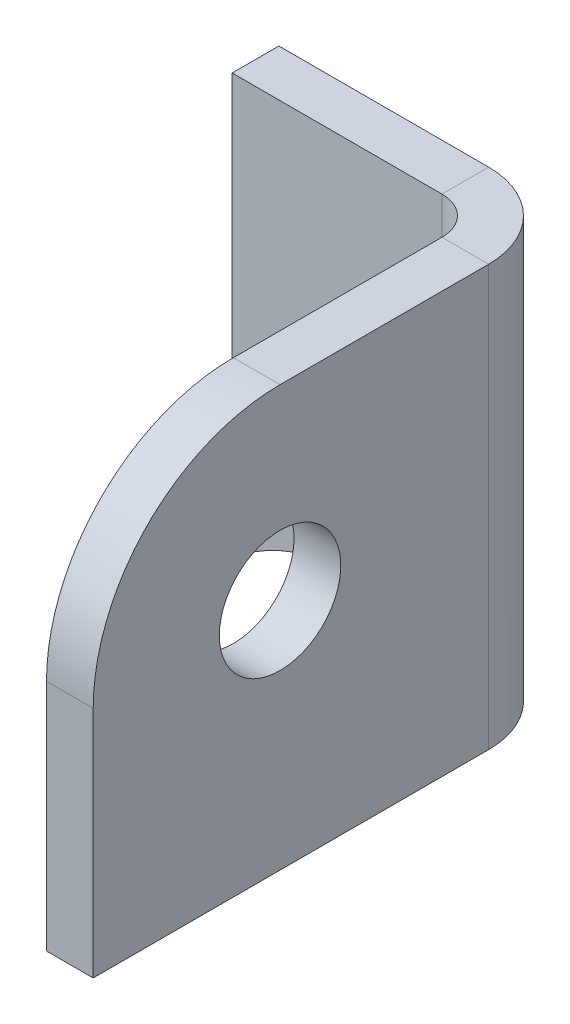
ISO-10303-21;
HEADER;
FILE_DESCRIPTION(('STEP AP214'),'2;1');
FILE_NAME('part.step','',(''),(''),'','','');
FILE_SCHEMA(('AUTOMOTIVE_DESIGN { 1 0 10303 214 1 1 1 1 }'));
ENDSEC;
DATA;
#1=APPLICATION_CONTEXT('core data for automotive mechanical design processes');
#2=APPLICATION_PROTOCOL_DEFINITION('international standard','automotive_design',2000,#1);
#3=PRODUCT_CONTEXT('',#1,'mechanical');
#4=PRODUCT('Part','Part','',(#3));
#5=PRODUCT_RELATED_PRODUCT_CATEGORY('part','',(#4));
#6=PRODUCT_DEFINITION_FORMATION('','',#4);
#7=PRODUCT_DEFINITION_CONTEXT('part definition',#1,'design');
#8=PRODUCT_DEFINITION('design','',#6,#7);
#9=PRODUCT_DEFINITION_SHAPE('','',#8);
#10=(LENGTH_UNIT() NAMED_UNIT(*) SI_UNIT(.MILLI.,.METRE.));
#11=(NAMED_UNIT(*) PLANE_ANGLE_UNIT() SI_UNIT($,.RADIAN.));
#12=(NAMED_UNIT(*) SI_UNIT($,.STERADIAN.) SOLID_ANGLE_UNIT());
#13=UNCERTAINTY_MEASURE_WITH_UNIT(LENGTH_MEASURE(1.E-05),#10,'distance_accuracy_value','');
#14=(GEOMETRIC_REPRESENTATION_CONTEXT(3) GLOBAL_UNCERTAINTY_ASSIGNED_CONTEXT((#13)) GLOBAL_UNIT_ASSIGNED_CONTEXT((#10,
#11,#12)) REPRESENTATION_CONTEXT('',''));
#15=CARTESIAN_POINT('',(0.,0.,0.));
#16=DIRECTION('',(0.,0.,1.));
#17=DIRECTION('',(1.,0.,0.));
#18=AXIS2_PLACEMENT_3D('',#15,#16,#17);
#19=CARTESIAN_POINT('',(16.80052301263,1.08510692792274E-06,1.77153816115405));
#20=DIRECTION('',(0.,-1.,0.));
#21=DIRECTION('',(0.,0.,1.));
#22=AXIS2_PLACEMENT_3D('',#19,#20,#21);
#23=PLANE('',#22);
#24=DIRECTION('',(0.,0.,1.));
#25=VECTOR('',#24,1.);
#26=CARTESIAN_POINT('',(16.80052301263,1.08510692792274E-06,1.77153816115405));
#27=LINE('',#26,#25);
#28=CARTESIAN_POINT('',(16.80052301263,1.08510692792274E-06,5.71500000000001));
#29=VERTEX_POINT('',#28);
#30=CARTESIAN_POINT('',(16.8005230126299,1.08510692792274E-06,32.596015148524));
#31=VERTEX_POINT('',#30);
#32=EDGE_CURVE('E146',#29,#31,#27,.T.);
#33=ORIENTED_EDGE('',*,*,#32,.F.);
#34=DIRECTION('',(1.,0.,0.));
#35=VECTOR('',#34,1.);
#36=CARTESIAN_POINT('',(16.80052301263,1.08510692792274E-06,5.71500000000001));
#37=LINE('',#36,#35);
#38=CARTESIAN_POINT('',(19.97552301263,1.08510691404495E-06,5.71500000000002));
#39=VERTEX_POINT('',#38);
#40=EDGE_CURVE('E12',#29,#39,#37,.T.);
#41=ORIENTED_EDGE('',*,*,#40,.T.);
#42=DIRECTION('',(0.,0.,1.));
#43=VECTOR('',#42,1.);
#44=CARTESIAN_POINT('',(19.9755230126301,1.08510692792274E-06,-6.62872272996323));
#45=LINE('',#44,#43);
#46=CARTESIAN_POINT('',(19.9755230126299,1.08510692792274E-06,32.596015148524));
#47=VERTEX_POINT('',#46);
#48=EDGE_CURVE('E111',#39,#47,#45,.T.);
#49=ORIENTED_EDGE('',*,*,#48,.T.);
#50=DIRECTION('',(-1.,0.,0.));
#51=VECTOR('',#50,1.);
#52=CARTESIAN_POINT('',(16.8005230126299,1.08510692792274E-06,32.596015148524));
#53=LINE('',#52,#51);
#54=EDGE_CURVE('E153',#47,#31,#53,.T.);
#55=ORIENTED_EDGE('',*,*,#54,.T.);
#56=EDGE_LOOP('',(#33,#41,#49,#55));
#57=FACE_BOUND('',#56,.T.);
#58=ADVANCED_FACE('F69',(#57),#23,.T.);
#59=CARTESIAN_POINT('',(16.80052301263,28.575,19.8960151485239));
#60=DIRECTION('',(0.,1.,0.));
#61=DIRECTION('',(0.,0.,-1.));
#62=AXIS2_PLACEMENT_3D('',#59,#60,#61);
#63=PLANE('',#62);
#64=DIRECTION('',(0.,0.,1.));
#65=VECTOR('',#64,1.);
#66=CARTESIAN_POINT('',(19.9755230126301,28.575,-6.62872272996323));
#67=LINE('',#66,#65);
#68=CARTESIAN_POINT('',(19.97552301263,28.575,19.896015148524));
#69=VERTEX_POINT('',#68);
#70=CARTESIAN_POINT('',(19.97552301263,28.575,5.71500000000002));
#71=VERTEX_POINT('',#70);
#72=EDGE_CURVE('E172',#69,#71,#67,.F.);
#73=ORIENTED_EDGE('',*,*,#72,.T.);
#74=DIRECTION('',(-1.,0.,0.));
#75=VECTOR('',#74,1.);
#76=CARTESIAN_POINT('',(16.80052301263,28.575,5.71500000000001));
#77=LINE('',#76,#75);
#78=CARTESIAN_POINT('',(16.80052301263,28.575,5.71500000000001));
#79=VERTEX_POINT('',#78);
#80=EDGE_CURVE('E180',#71,#79,#77,.T.);
#81=ORIENTED_EDGE('',*,*,#80,.T.);
#82=DIRECTION('',(0.,0.,-1.));
#83=VECTOR('',#82,1.);
#84=CARTESIAN_POINT('',(16.80052301263,28.575,19.8960151485239));
#85=LINE('',#84,#83);
#86=CARTESIAN_POINT('',(16.80052301263,28.575,19.8960151485239));
#87=VERTEX_POINT('',#86);
#88=EDGE_CURVE('E72',#87,#79,#85,.T.);
#89=ORIENTED_EDGE('',*,*,#88,.F.);
#90=DIRECTION('',(-1.,0.,0.));
#91=VECTOR('',#90,1.);
#92=CARTESIAN_POINT('',(16.80052301263,28.575,19.8960151485239));
#93=LINE('',#92,#91);
#94=EDGE_CURVE('E94',#69,#87,#93,.T.);
#95=ORIENTED_EDGE('',*,*,#94,.F.);
#96=EDGE_LOOP('',(#73,#81,#89,#95));
#97=FACE_BOUND('',#96,.T.);
#98=ADVANCED_FACE('F192',(#97),#63,.T.);
#99=CARTESIAN_POINT('',(16.8005230126301,-9.52499945744657,-6.62872272996324));
#100=DIRECTION('',(-1.,0.,0.));
#101=DIRECTION('',(0.,0.,1.));
#102=AXIS2_PLACEMENT_3D('',#99,#100,#101);
#103=PLANE('',#102);
#104=CARTESIAN_POINT('',(16.80052301263,15.875,19.896015148524));
#105=DIRECTION('',(-1.,0.,0.));
#106=DIRECTION('',(0.,0.,1.));
#107=AXIS2_PLACEMENT_3D('',#104,#105,#106);
#108=CIRCLE('',#107,4.1275);
#109=CARTESIAN_POINT('',(16.80052301263,15.875,24.023515148524));
#110=VERTEX_POINT('',#109);
#111=EDGE_CURVE('E167',#110,#110,#108,.T.);
#112=ORIENTED_EDGE('',*,*,#111,.F.);
#113=EDGE_LOOP('',(#112));
#114=FACE_BOUND('',#113,.T.);
#115=ORIENTED_EDGE('',*,*,#88,.T.);
#116=DIRECTION('',(0.,-1.,0.));
#117=VECTOR('',#116,1.);
#118=CARTESIAN_POINT('',(16.80052301263,-9.52499945744657,5.71500000000001));
#119=LINE('',#118,#117);
#120=EDGE_CURVE('E151',#79,#29,#119,.T.);
#121=ORIENTED_EDGE('',*,*,#120,.T.);
#122=ORIENTED_EDGE('',*,*,#32,.T.);
#123=DIRECTION('',(0.,1.,0.));
#124=VECTOR('',#123,1.);
#125=CARTESIAN_POINT('',(16.8005230126299,1.08510692792274E-06,32.596015148524));
#126=LINE('',#125,#124);
#127=CARTESIAN_POINT('',(16.8005230126299,15.8749999999999,32.596015148524));
#128=VERTEX_POINT('',#127);
#129=EDGE_CURVE('E150',#31,#128,#126,.T.);
#130=ORIENTED_EDGE('',*,*,#129,.T.);
#131=CARTESIAN_POINT('',(16.80052301263,15.875,19.896015148524));
#132=DIRECTION('',(-1.,0.,0.));
#133=DIRECTION('',(0.,0.,1.));
#134=AXIS2_PLACEMENT_3D('',#131,#132,#133);
#135=CIRCLE('',#134,12.7);
#136=EDGE_CURVE('E160',#128,#87,#135,.T.);
#137=ORIENTED_EDGE('',*,*,#136,.T.);
#138=EDGE_LOOP('',(#115,#121,#122,#130,#137));
#139=FACE_BOUND('',#138,.T.);
#140=ADVANCED_FACE('F148',(#114,#139),#103,.T.);
#141=CARTESIAN_POINT('',(16.8005230126299,1.08510692792274E-06,32.596015148524));
#142=DIRECTION('',(0.,0.,1.));
#143=DIRECTION('',(0.,1.,0.));
#144=AXIS2_PLACEMENT_3D('',#141,#142,#143);
#145=PLANE('',#144);
#146=ORIENTED_EDGE('',*,*,#54,.F.);
#147=DIRECTION('',(0.,1.,0.));
#148=VECTOR('',#147,1.);
#149=CARTESIAN_POINT('',(19.9755230126299,-9.52499945744657,32.596015148524));
#150=LINE('',#149,#148);
#151=CARTESIAN_POINT('',(19.9755230126299,15.8749999999999,32.596015148524));
#152=VERTEX_POINT('',#151);
#153=EDGE_CURVE('E173',#47,#152,#150,.T.);
#154=ORIENTED_EDGE('',*,*,#153,.T.);
#155=DIRECTION('',(-1.,0.,0.));
#156=VECTOR('',#155,1.);
#157=CARTESIAN_POINT('',(16.8005230126299,15.8749999999999,32.596015148524));
#158=LINE('',#157,#156);
#159=EDGE_CURVE('E157',#152,#128,#158,.T.);
#160=ORIENTED_EDGE('',*,*,#159,.T.);
#161=ORIENTED_EDGE('',*,*,#129,.F.);
#162=EDGE_LOOP('',(#146,#154,#160,#161));
#163=FACE_BOUND('',#162,.T.);
#164=ADVANCED_FACE('F159',(#163),#145,.T.);
#165=CARTESIAN_POINT('',(16.80052301263,15.875,19.896015148524));
#166=DIRECTION('',(-1.,0.,0.));
#167=DIRECTION('',(0.,0.,1.));
#168=AXIS2_PLACEMENT_3D('',#165,#166,#167);
#169=CYLINDRICAL_SURFACE('',#168,12.7);
#170=ORIENTED_EDGE('',*,*,#159,.F.);
#171=CARTESIAN_POINT('',(19.97552301263,15.875,19.8960151485241));
#172=DIRECTION('',(-1.,0.,0.));
#173=DIRECTION('',(0.,0.,1.));
#174=AXIS2_PLACEMENT_3D('',#171,#172,#173);
#175=CIRCLE('',#174,12.7);
#176=EDGE_CURVE('E170',#152,#69,#175,.T.);
#177=ORIENTED_EDGE('',*,*,#176,.T.);
#178=ORIENTED_EDGE('',*,*,#94,.T.);
#179=ORIENTED_EDGE('',*,*,#136,.F.);
#180=EDGE_LOOP('',(#170,#177,#178,#179));
#181=FACE_BOUND('',#180,.T.);
#182=ADVANCED_FACE('F320',(#181),#169,.T.);
#183=CARTESIAN_POINT('',(16.80052301263,15.875,19.896015148524));
#184=DIRECTION('',(-1.,0.,0.));
#185=DIRECTION('',(0.,0.,1.));
#186=AXIS2_PLACEMENT_3D('',#183,#184,#185);
#187=CYLINDRICAL_SURFACE('',#186,4.1275);
#188=ORIENTED_EDGE('',*,*,#111,.T.);
#189=EDGE_LOOP('',(#188));
#190=FACE_BOUND('',#189,.T.);
#191=CARTESIAN_POINT('',(19.97552301263,15.875,19.8960151485241));
#192=DIRECTION('',(-1.,0.,0.));
#193=DIRECTION('',(0.,0.,1.));
#194=AXIS2_PLACEMENT_3D('',#191,#192,#193);
#195=CIRCLE('',#194,4.1275);
#196=CARTESIAN_POINT('',(19.97552301263,15.875,24.023515148524));
#197=VERTEX_POINT('',#196);
#198=EDGE_CURVE('E152',#197,#197,#195,.T.);
#199=ORIENTED_EDGE('',*,*,#198,.F.);
#200=EDGE_LOOP('',(#199));
#201=FACE_BOUND('',#200,.T.);
#202=ADVANCED_FACE('F401',(#190,#201),#187,.F.);
#203=CARTESIAN_POINT('',(19.9755230126301,-9.52499945744657,-6.62872272996323));
#204=DIRECTION('',(-1.,0.,0.));
#205=DIRECTION('',(0.,0.,1.));
#206=AXIS2_PLACEMENT_3D('',#203,#204,#205);
#207=PLANE('',#206);
#208=DIRECTION('',(0.,-1.,0.));
#209=VECTOR('',#208,1.);
#210=CARTESIAN_POINT('',(19.97552301263,-9.52499945744657,5.71500000000002));
#211=LINE('',#210,#209);
#212=EDGE_CURVE('E77',#71,#39,#211,.T.);
#213=ORIENTED_EDGE('',*,*,#212,.F.);
#214=ORIENTED_EDGE('',*,*,#72,.F.);
#215=ORIENTED_EDGE('',*,*,#176,.F.);
#216=ORIENTED_EDGE('',*,*,#153,.F.);
#217=ORIENTED_EDGE('',*,*,#48,.F.);
#218=EDGE_LOOP('',(#213,#214,#215,#216,#217));
#219=FACE_BOUND('',#218,.T.);
#220=ORIENTED_EDGE('',*,*,#198,.T.);
#221=EDGE_LOOP('',(#220));
#222=FACE_BOUND('',#221,.T.);
#223=ADVANCED_FACE('F200',(#219,#222),#207,.F.);
#224=CARTESIAN_POINT('',(0.,0.,3.175));
#225=DIRECTION('',(-1.,0.,0.));
#226=DIRECTION('',(0.,-1.,0.));
#227=AXIS2_PLACEMENT_3D('',#224,#225,#226);
#228=PLANE('',#227);
#229=DIRECTION('',(0.,0.,1.));
#230=VECTOR('',#229,1.);
#231=CARTESIAN_POINT('',(0.,28.575,3.175));
#232=LINE('',#231,#230);
#233=CARTESIAN_POINT('',(0.,28.575,0.));
#234=VERTEX_POINT('',#233);
#235=CARTESIAN_POINT('',(0.,28.575,3.175));
#236=VERTEX_POINT('',#235);
#237=EDGE_CURVE('E289',#234,#236,#232,.T.);
#238=ORIENTED_EDGE('',*,*,#237,.F.);
#239=DIRECTION('',(0.,1.,0.));
#240=VECTOR('',#239,1.);
#241=CARTESIAN_POINT('',(0.,-9.52499945744657,0.));
#242=LINE('',#241,#240);
#243=CARTESIAN_POINT('',(0.,0.,0.));
#244=VERTEX_POINT('',#243);
#245=EDGE_CURVE('E350',#234,#244,#242,.F.);
#246=ORIENTED_EDGE('',*,*,#245,.T.);
#247=DIRECTION('',(0.,0.,1.));
#248=VECTOR('',#247,1.);
#249=CARTESIAN_POINT('',(0.,0.,3.175));
#250=LINE('',#249,#248);
#251=CARTESIAN_POINT('',(0.,0.,3.175));
#252=VERTEX_POINT('',#251);
#253=EDGE_CURVE('E120',#244,#252,#250,.T.);
#254=ORIENTED_EDGE('',*,*,#253,.T.);
#255=DIRECTION('',(0.,-1.,0.));
#256=VECTOR('',#255,1.);
#257=CARTESIAN_POINT('',(0.,0.,3.175));
#258=LINE('',#257,#256);
#259=EDGE_CURVE('E341',#236,#252,#258,.T.);
#260=ORIENTED_EDGE('',*,*,#259,.F.);
#261=EDGE_LOOP('',(#238,#246,#254,#260));
#262=FACE_BOUND('',#261,.T.);
#263=ADVANCED_FACE('F300',(#262),#228,.T.);
#264=CARTESIAN_POINT('',(8.40026212151272,-9.52499945744657,3.175));
#265=DIRECTION('',(0.,0.,1.));
#266=DIRECTION('',(1.,0.,0.));
#267=AXIS2_PLACEMENT_3D('',#264,#265,#266);
#268=PLANE('',#267);
#269=DIRECTION('',(0.,-1.,0.));
#270=VECTOR('',#269,1.);
#271=CARTESIAN_POINT('',(14.26052301263,-9.52499945744657,3.175));
#272=LINE('',#271,#270);
#273=CARTESIAN_POINT('',(14.26052301263,28.575,3.175));
#274=VERTEX_POINT('',#273);
#275=CARTESIAN_POINT('',(14.26052301263,1.74209247714419,3.175));
#276=VERTEX_POINT('',#275);
#277=EDGE_CURVE('E329',#274,#276,#272,.T.);
#278=ORIENTED_EDGE('',*,*,#277,.F.);
#279=DIRECTION('',(-1.,0.,0.));
#280=VECTOR('',#279,1.);
#281=CARTESIAN_POINT('',(34.9249999999999,28.575,3.175));
#282=LINE('',#281,#280);
#283=EDGE_CURVE('E344',#274,#236,#282,.T.);
#284=ORIENTED_EDGE('',*,*,#283,.T.);
#285=ORIENTED_EDGE('',*,*,#259,.T.);
#286=CARTESIAN_POINT('',(8.40026212151272,-9.52499945744657,3.175));
#287=DIRECTION('',(0.,0.,-1.));
#288=DIRECTION('',(1.,0.,0.));
#289=AXIS2_PLACEMENT_3D('',#286,#287,#288);
#290=CIRCLE('',#289,12.7000007234047);
#291=EDGE_CURVE('E339',#252,#276,#290,.T.);
#292=ORIENTED_EDGE('',*,*,#291,.T.);
#293=EDGE_LOOP('',(#278,#284,#285,#292));
#294=FACE_BOUND('',#293,.T.);
#295=ADVANCED_FACE('F303',(#294),#268,.T.);
#296=CARTESIAN_POINT('',(34.9249999999999,28.575,3.175));
#297=DIRECTION('',(0.,1.,0.));
#298=DIRECTION('',(-1.,0.,0.));
#299=AXIS2_PLACEMENT_3D('',#296,#297,#298);
#300=PLANE('',#299);
#301=DIRECTION('',(0.,0.,1.));
#302=VECTOR('',#301,1.);
#303=CARTESIAN_POINT('',(14.26052301263,28.575,3.175));
#304=LINE('',#303,#302);
#305=CARTESIAN_POINT('',(14.26052301263,28.575,0.));
#306=VERTEX_POINT('',#305);
#307=EDGE_CURVE('E353',#306,#274,#304,.T.);
#308=ORIENTED_EDGE('',*,*,#307,.F.);
#309=DIRECTION('',(1.,0.,0.));
#310=VECTOR('',#309,1.);
#311=CARTESIAN_POINT('',(8.40026212151272,28.575,0.));
#312=LINE('',#311,#310);
#313=EDGE_CURVE('E340',#306,#234,#312,.F.);
#314=ORIENTED_EDGE('',*,*,#313,.T.);
#315=ORIENTED_EDGE('',*,*,#237,.T.);
#316=ORIENTED_EDGE('',*,*,#283,.F.);
#317=EDGE_LOOP('',(#308,#314,#315,#316));
#318=FACE_BOUND('',#317,.T.);
#319=ADVANCED_FACE('F307',(#318),#300,.T.);
#320=CARTESIAN_POINT('',(8.40026212151272,-9.52499945744657,0.));
#321=DIRECTION('',(0.,0.,1.));
#322=DIRECTION('',(1.,0.,0.));
#323=AXIS2_PLACEMENT_3D('',#320,#321,#322);
#324=PLANE('',#323);
#325=ORIENTED_EDGE('',*,*,#313,.F.);
#326=DIRECTION('',(0.,-1.,0.));
#327=VECTOR('',#326,1.);
#328=CARTESIAN_POINT('',(14.26052301263,-9.52499945744657,0.));
#329=LINE('',#328,#327);
#330=CARTESIAN_POINT('',(14.26052301263,1.74209247714419,0.));
#331=VERTEX_POINT('',#330);
#332=EDGE_CURVE('E357',#306,#331,#329,.T.);
#333=ORIENTED_EDGE('',*,*,#332,.T.);
#334=CARTESIAN_POINT('',(8.40026212151272,-9.52499945744657,0.));
#335=DIRECTION('',(0.,0.,-1.));
#336=DIRECTION('',(-1.,0.,0.));
#337=AXIS2_PLACEMENT_3D('',#334,#335,#336);
#338=CIRCLE('',#337,12.7000007234047);
#339=EDGE_CURVE('E186',#244,#331,#338,.T.);
#340=ORIENTED_EDGE('',*,*,#339,.F.);
#341=ORIENTED_EDGE('',*,*,#245,.F.);
#342=EDGE_LOOP('',(#325,#333,#340,#341));
#343=FACE_BOUND('',#342,.T.);
#344=ADVANCED_FACE('F311',(#343),#324,.F.);
#345=CARTESIAN_POINT('',(8.40026212151272,-9.52499945744657,3.175));
#346=DIRECTION('',(0.,0.,1.));
#347=DIRECTION('',(1.,0.,0.));
#348=AXIS2_PLACEMENT_3D('',#345,#346,#347);
#349=CYLINDRICAL_SURFACE('',#348,12.7000007234047);
#350=CARTESIAN_POINT('',(14.26052301263,1.74209247714418,3.175));
#351=CARTESIAN_POINT('',(14.26052301263,1.74209247714418,0.));
#352=B_SPLINE_CURVE_WITH_KNOTS('',1,(#350,#351),.UNSPECIFIED.,.F.,.F.,(2,2),(0.,1.),.UNSPECIFIED.);
#353=EDGE_CURVE('E337',#276,#331,#352,.T.);
#354=ORIENTED_EDGE('',*,*,#353,.F.);
#355=ORIENTED_EDGE('',*,*,#291,.F.);
#356=ORIENTED_EDGE('',*,*,#253,.F.);
#357=ORIENTED_EDGE('',*,*,#339,.T.);
#358=EDGE_LOOP('',(#354,#355,#356,#357));
#359=FACE_BOUND('',#358,.T.);
#360=ADVANCED_FACE('F315',(#359),#349,.F.);
#361=CARTESIAN_POINT('',(14.26052301263,28.575,5.715));
#362=DIRECTION('',(0.,-1.,0.));
#363=DIRECTION('',(0.,0.,-1.));
#364=AXIS2_PLACEMENT_3D('',#361,#362,#363);
#365=PLANE('',#364);
#366=ORIENTED_EDGE('',*,*,#80,.F.);
#367=CARTESIAN_POINT('',(14.26052301263,28.575,5.715));
#368=DIRECTION('',(0.,1.,0.));
#369=DIRECTION('',(0.,0.,1.));
#370=AXIS2_PLACEMENT_3D('',#367,#368,#369);
#371=CIRCLE('',#370,5.715);
#372=EDGE_CURVE('E211',#71,#306,#371,.T.);
#373=ORIENTED_EDGE('',*,*,#372,.T.);
#374=ORIENTED_EDGE('',*,*,#307,.T.);
#375=CARTESIAN_POINT('',(14.26052301263,28.575,5.715));
#376=DIRECTION('',(0.,1.,0.));
#377=DIRECTION('',(0.,0.,1.));
#378=AXIS2_PLACEMENT_3D('',#375,#376,#377);
#379=CIRCLE('',#378,2.54);
#380=EDGE_CURVE('E219',#79,#274,#379,.T.);
#381=ORIENTED_EDGE('',*,*,#380,.F.);
#382=EDGE_LOOP('',(#366,#373,#374,#381));
#383=FACE_BOUND('',#382,.T.);
#384=ADVANCED_FACE('F253',(#383),#365,.F.);
#385=CARTESIAN_POINT('',(14.26052301263,1.74209247714418,0.));
#386=CARTESIAN_POINT('',(14.9893650073298,1.43357275976665,0.));
#387=CARTESIAN_POINT('',(15.6405817572661,1.13497117986703,0.138241157023691));
#388=CARTESIAN_POINT('',(16.7438913728681,0.554274049187946,0.534490090856933));
#389=CARTESIAN_POINT('',(17.1970453621608,0.272288558223827,0.792069674536254));
#390=CARTESIAN_POINT('',(17.5596360544273,1.08510692185121E-06,1.04840829539986));
#391=CARTESIAN_POINT('',(14.26052301263,1.74209247714418,3.175));
#392=CARTESIAN_POINT('',(14.5842303507001,1.43378461528035,3.175));
#393=CARTESIAN_POINT('',(14.8738824546905,1.13497117986703,3.23644051423275));
#394=CARTESIAN_POINT('',(15.3642422838469,0.554274049187941,3.41255115149197));
#395=CARTESIAN_POINT('',(15.5655055064179,0.272522658250216,3.52693301626072));
#396=CARTESIAN_POINT('',(15.7267954756511,1.0851069175144E-06,3.64095924239994));
#397=B_SPLINE_SURFACE_WITH_KNOTS('',1,3,((#385,#386,#387,#388,#389,#390),(#391,#392,#393,#394,
#395,#396)),.UNSPECIFIED.,.F.,.F.,.F.,(2,2),(4,2,4),(0.,1.),(0.,0.5,1.),.UNSPECIFIED.);
#398=CARTESIAN_POINT('',(14.26052301263,1.74209247714418,0.));
#399=CARTESIAN_POINT('',(14.9893650073298,1.43357275976665,0.));
#400=CARTESIAN_POINT('',(15.6405817572661,1.13497117986703,0.138241157023691));
#401=CARTESIAN_POINT('',(16.7438913728681,0.554274049187946,0.534490090856933));
#402=CARTESIAN_POINT('',(17.1970453621608,0.272288558223827,0.792069674536254));
#403=CARTESIAN_POINT('',(17.5596360544273,1.08510692185121E-06,1.04840829539986));
#404=B_SPLINE_CURVE_WITH_KNOTS('',3,(#398,#399,#400,#401,#402,#403),.UNSPECIFIED.,.F.,.F.,(4,2,
4),(0.,0.5,1.),.UNSPECIFIED.);
#405=CARTESIAN_POINT('',(17.5596360544273,1.08510691404495E-06,1.04840829539986));
#406=VERTEX_POINT('',#405);
#407=EDGE_CURVE('E220',#331,#406,#404,.T.);
#408=CARTESIAN_POINT('',(17.5596360544273,1.08510692185121E-06,1.04840829539986));
#409=CARTESIAN_POINT('',(15.7267954756511,1.0851069175144E-06,3.64095924239994));
#410=B_SPLINE_CURVE_WITH_KNOTS('',1,(#408,#409),.UNSPECIFIED.,.F.,.F.,(2,2),(0.,1.),.UNSPECIFIED.);
#411=CARTESIAN_POINT('',(15.7267954756511,1.0851069175144E-06,3.64095924239994));
#412=VERTEX_POINT('',#411);
#413=EDGE_CURVE('E216',#406,#412,#410,.T.);
#414=CARTESIAN_POINT('',(15.7267954756511,1.0851069175144E-06,3.64095924239994));
#415=CARTESIAN_POINT('',(15.5655055064179,0.272522658250216,3.52693301626072));
#416=CARTESIAN_POINT('',(15.3642422838469,0.554274049187941,3.41255115149197));
#417=CARTESIAN_POINT('',(14.8738824546905,1.13497117986703,3.23644051423275));
#418=CARTESIAN_POINT('',(14.5842303507001,1.43378461528035,3.175));
#419=CARTESIAN_POINT('',(14.26052301263,1.74209247714418,3.175));
#420=B_SPLINE_CURVE_WITH_KNOTS('',3,(#414,#415,#416,#417,#418,#419),.UNSPECIFIED.,.F.,.F.,(4,2,
4),(0.,0.5,1.),.UNSPECIFIED.);
#421=EDGE_CURVE('E223',#276,#412,#420,.F.);
#422=ORIENTED_EDGE('',*,*,#353,.T.);
#423=ORIENTED_EDGE('',*,*,#407,.T.);
#424=ORIENTED_EDGE('',*,*,#413,.T.);
#425=ORIENTED_EDGE('',*,*,#421,.F.);
#426=EDGE_LOOP('',(#422,#423,#424,#425));
#427=FACE_BOUND('',#426,.T.);
#428=ADVANCED_FACE('F242',(#427),#397,.F.);
#429=CARTESIAN_POINT('',(14.26052301263,1.08510692445329E-06,5.715));
#430=DIRECTION('',(0.,1.,0.));
#431=DIRECTION('',(0.,0.,1.));
#432=AXIS2_PLACEMENT_3D('',#429,#430,#431);
#433=PLANE('',#432);
#434=CARTESIAN_POINT('',(14.26052301263,1.08510691404495E-06,5.715));
#435=DIRECTION('',(0.,1.,0.));
#436=DIRECTION('',(0.,0.,1.));
#437=AXIS2_PLACEMENT_3D('',#434,#435,#436);
#438=CIRCLE('',#437,5.715);
#439=EDGE_CURVE('E208',#406,#39,#438,.F.);
#440=ORIENTED_EDGE('',*,*,#439,.T.);
#441=ORIENTED_EDGE('',*,*,#40,.F.);
#442=CARTESIAN_POINT('',(14.26052301263,1.08510692445329E-06,5.715));
#443=DIRECTION('',(0.,-1.,0.));
#444=DIRECTION('',(0.,0.,-1.));
#445=AXIS2_PLACEMENT_3D('',#442,#443,#444);
#446=CIRCLE('',#445,2.54);
#447=EDGE_CURVE('E85',#412,#29,#446,.T.);
#448=ORIENTED_EDGE('',*,*,#447,.F.);
#449=ORIENTED_EDGE('',*,*,#413,.F.);
#450=EDGE_LOOP('',(#440,#441,#448,#449));
#451=FACE_BOUND('',#450,.T.);
#452=ADVANCED_FACE('F214',(#451),#433,.F.);
#453=CARTESIAN_POINT('',(14.26052301263,-14.3142626774765,5.715));
#454=DIRECTION('',(0.,1.,0.));
#455=DIRECTION('',(0.,0.,1.));
#456=AXIS2_PLACEMENT_3D('',#453,#454,#455);
#457=CYLINDRICAL_SURFACE('',#456,2.54);
#458=ORIENTED_EDGE('',*,*,#421,.T.);
#459=ORIENTED_EDGE('',*,*,#447,.T.);
#460=ORIENTED_EDGE('',*,*,#120,.F.);
#461=ORIENTED_EDGE('',*,*,#380,.T.);
#462=ORIENTED_EDGE('',*,*,#277,.T.);
#463=EDGE_LOOP('',(#458,#459,#460,#461,#462));
#464=FACE_BOUND('',#463,.T.);
#465=ADVANCED_FACE('F299',(#464),#457,.F.);
#466=CARTESIAN_POINT('',(14.26052301263,-14.3142626774765,5.715));
#467=DIRECTION('',(0.,1.,0.));
#468=DIRECTION('',(0.,0.,1.));
#469=AXIS2_PLACEMENT_3D('',#466,#467,#468);
#470=CYLINDRICAL_SURFACE('',#469,5.715);
#471=ORIENTED_EDGE('',*,*,#407,.F.);
#472=ORIENTED_EDGE('',*,*,#332,.F.);
#473=ORIENTED_EDGE('',*,*,#372,.F.);
#474=ORIENTED_EDGE('',*,*,#212,.T.);
#475=ORIENTED_EDGE('',*,*,#439,.F.);
#476=EDGE_LOOP('',(#471,#472,#473,#474,#475));
#477=FACE_BOUND('',#476,.T.);
#478=ADVANCED_FACE('F207',(#477),#470,.T.);
#479=CLOSED_SHELL('',(#58,#98,#140,#164,#182,#202,#223,#263,#295,#319,#344,#360,#384,#428,#452,
#465,#478));
#480=MANIFOLD_SOLID_BREP('B2',#479);
#481=ADVANCED_BREP_SHAPE_REPRESENTATION('',(#18,#480),#14);
#482=SHAPE_DEFINITION_REPRESENTATION(#9,#481);
ENDSEC;
END-ISO-10303-21;
